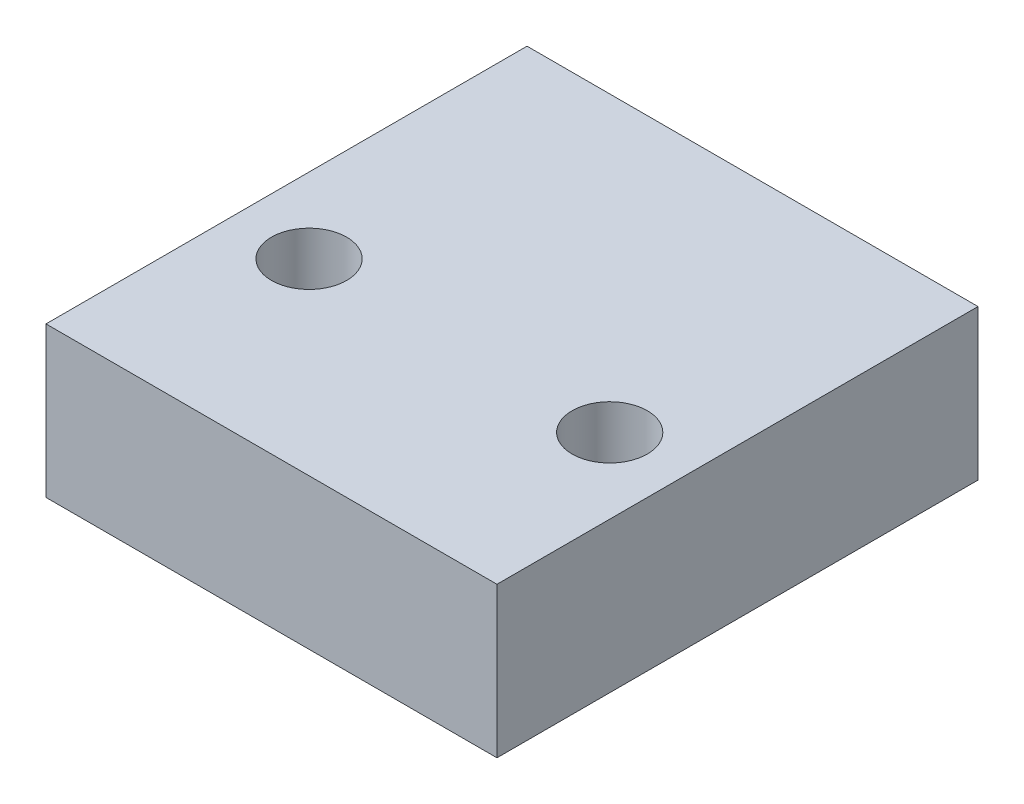
ISO-10303-21;
HEADER;
FILE_DESCRIPTION(('STEP AP214'),'2;1');
FILE_NAME('part.step','',(''),(''),'','','');
FILE_SCHEMA(('AUTOMOTIVE_DESIGN { 1 0 10303 214 1 1 1 1 }'));
ENDSEC;
DATA;
#1=APPLICATION_CONTEXT('core data for automotive mechanical design processes');
#2=APPLICATION_PROTOCOL_DEFINITION('international standard','automotive_design',2000,#1);
#3=PRODUCT_CONTEXT('',#1,'mechanical');
#4=PRODUCT('Part','Part','',(#3));
#5=PRODUCT_RELATED_PRODUCT_CATEGORY('part','',(#4));
#6=PRODUCT_DEFINITION_FORMATION('','',#4);
#7=PRODUCT_DEFINITION_CONTEXT('part definition',#1,'design');
#8=PRODUCT_DEFINITION('design','',#6,#7);
#9=PRODUCT_DEFINITION_SHAPE('','',#8);
#10=(LENGTH_UNIT() NAMED_UNIT(*) SI_UNIT(.MILLI.,.METRE.));
#11=(NAMED_UNIT(*) PLANE_ANGLE_UNIT() SI_UNIT($,.RADIAN.));
#12=(NAMED_UNIT(*) SI_UNIT($,.STERADIAN.) SOLID_ANGLE_UNIT());
#13=UNCERTAINTY_MEASURE_WITH_UNIT(LENGTH_MEASURE(1.E-05),#10,'distance_accuracy_value','');
#14=(GEOMETRIC_REPRESENTATION_CONTEXT(3) GLOBAL_UNCERTAINTY_ASSIGNED_CONTEXT((#13)) GLOBAL_UNIT_ASSIGNED_CONTEXT((#10,
#11,#12)) REPRESENTATION_CONTEXT('',''));
#15=CARTESIAN_POINT('',(0.,0.,0.));
#16=DIRECTION('',(0.,0.,1.));
#17=DIRECTION('',(1.,0.,0.));
#18=AXIS2_PLACEMENT_3D('',#15,#16,#17);
#19=CARTESIAN_POINT('',(15.,10.,0.));
#20=DIRECTION('',(1.,0.,0.));
#21=DIRECTION('',(0.,0.,-1.));
#22=AXIS2_PLACEMENT_3D('',#19,#20,#21);
#23=PLANE('',#22);
#24=DIRECTION('',(0.,0.,1.));
#25=VECTOR('',#24,1.);
#26=CARTESIAN_POINT('',(15.,0.,0.));
#27=LINE('',#26,#25);
#28=CARTESIAN_POINT('',(15.,0.,-19.5));
#29=VERTEX_POINT('',#28);
#30=CARTESIAN_POINT('',(15.,0.,12.5));
#31=VERTEX_POINT('',#30);
#32=EDGE_CURVE('E109',#29,#31,#27,.T.);
#33=ORIENTED_EDGE('',*,*,#32,.F.);
#34=DIRECTION('',(0.,-1.,0.));
#35=VECTOR('',#34,1.);
#36=CARTESIAN_POINT('',(15.,10.,-19.5));
#37=LINE('',#36,#35);
#38=CARTESIAN_POINT('',(15.,10.,-19.5));
#39=VERTEX_POINT('',#38);
#40=EDGE_CURVE('E11',#39,#29,#37,.T.);
#41=ORIENTED_EDGE('',*,*,#40,.F.);
#42=DIRECTION('',(0.,0.,1.));
#43=VECTOR('',#42,1.);
#44=CARTESIAN_POINT('',(15.,10.,0.));
#45=LINE('',#44,#43);
#46=CARTESIAN_POINT('',(15.,10.,12.5));
#47=VERTEX_POINT('',#46);
#48=EDGE_CURVE('E96',#39,#47,#45,.T.);
#49=ORIENTED_EDGE('',*,*,#48,.T.);
#50=DIRECTION('',(0.,-1.,0.));
#51=VECTOR('',#50,1.);
#52=CARTESIAN_POINT('',(15.,10.,12.5));
#53=LINE('',#52,#51);
#54=EDGE_CURVE('E75',#47,#31,#53,.T.);
#55=ORIENTED_EDGE('',*,*,#54,.T.);
#56=EDGE_LOOP('',(#33,#41,#49,#55));
#57=FACE_BOUND('',#56,.T.);
#58=ADVANCED_FACE('F35',(#57),#23,.T.);
#59=CARTESIAN_POINT('',(0.,10.,-19.5));
#60=DIRECTION('',(0.,0.,-1.));
#61=DIRECTION('',(-1.,0.,0.));
#62=AXIS2_PLACEMENT_3D('',#59,#60,#61);
#63=PLANE('',#62);
#64=DIRECTION('',(1.,0.,0.));
#65=VECTOR('',#64,1.);
#66=CARTESIAN_POINT('',(0.,0.,-19.5));
#67=LINE('',#66,#65);
#68=CARTESIAN_POINT('',(-15.,0.,-19.5));
#69=VERTEX_POINT('',#68);
#70=EDGE_CURVE('E87',#69,#29,#67,.T.);
#71=ORIENTED_EDGE('',*,*,#70,.F.);
#72=DIRECTION('',(0.,-1.,0.));
#73=VECTOR('',#72,1.);
#74=CARTESIAN_POINT('',(-15.,10.,-19.5));
#75=LINE('',#74,#73);
#76=CARTESIAN_POINT('',(-15.,10.,-19.5));
#77=VERTEX_POINT('',#76);
#78=EDGE_CURVE('E44',#77,#69,#75,.T.);
#79=ORIENTED_EDGE('',*,*,#78,.F.);
#80=DIRECTION('',(1.,0.,0.));
#81=VECTOR('',#80,1.);
#82=CARTESIAN_POINT('',(0.,10.,-19.5));
#83=LINE('',#82,#81);
#84=EDGE_CURVE('E85',#77,#39,#83,.T.);
#85=ORIENTED_EDGE('',*,*,#84,.T.);
#86=ORIENTED_EDGE('',*,*,#40,.T.);
#87=EDGE_LOOP('',(#71,#79,#85,#86));
#88=FACE_BOUND('',#87,.T.);
#89=ADVANCED_FACE('F83',(#88),#63,.T.);
#90=CARTESIAN_POINT('',(-15.,10.,0.));
#91=DIRECTION('',(1.,0.,0.));
#92=DIRECTION('',(0.,0.,-1.));
#93=AXIS2_PLACEMENT_3D('',#90,#91,#92);
#94=PLANE('',#93);
#95=DIRECTION('',(0.,0.,1.));
#96=VECTOR('',#95,1.);
#97=CARTESIAN_POINT('',(-15.,0.,0.));
#98=LINE('',#97,#96);
#99=CARTESIAN_POINT('',(-15.,0.,12.5));
#100=VERTEX_POINT('',#99);
#101=EDGE_CURVE('E112',#69,#100,#98,.T.);
#102=ORIENTED_EDGE('',*,*,#101,.T.);
#103=DIRECTION('',(0.,-1.,0.));
#104=VECTOR('',#103,1.);
#105=CARTESIAN_POINT('',(-15.,10.,12.5));
#106=LINE('',#105,#104);
#107=CARTESIAN_POINT('',(-15.,10.,12.5));
#108=VERTEX_POINT('',#107);
#109=EDGE_CURVE('E90',#108,#100,#106,.T.);
#110=ORIENTED_EDGE('',*,*,#109,.F.);
#111=DIRECTION('',(0.,0.,1.));
#112=VECTOR('',#111,1.);
#113=CARTESIAN_POINT('',(-15.,10.,0.));
#114=LINE('',#113,#112);
#115=EDGE_CURVE('E92',#77,#108,#114,.T.);
#116=ORIENTED_EDGE('',*,*,#115,.F.);
#117=ORIENTED_EDGE('',*,*,#78,.T.);
#118=EDGE_LOOP('',(#102,#110,#116,#117));
#119=FACE_BOUND('',#118,.T.);
#120=ADVANCED_FACE('F93',(#119),#94,.F.);
#121=CARTESIAN_POINT('',(-10.,10.,0.));
#122=DIRECTION('',(0.,-1.,0.));
#123=DIRECTION('',(0.,0.,-1.));
#124=AXIS2_PLACEMENT_3D('',#121,#122,#123);
#125=CYLINDRICAL_SURFACE('',#124,2.5);
#126=CARTESIAN_POINT('',(-10.,10.,0.));
#127=DIRECTION('',(0.,1.,0.));
#128=DIRECTION('',(0.,0.,1.));
#129=AXIS2_PLACEMENT_3D('',#126,#127,#128);
#130=CIRCLE('',#129,2.5);
#131=CARTESIAN_POINT('',(-10.,10.,2.5));
#132=VERTEX_POINT('',#131);
#133=EDGE_CURVE('E98',#132,#132,#130,.T.);
#134=ORIENTED_EDGE('',*,*,#133,.T.);
#135=EDGE_LOOP('',(#134));
#136=FACE_BOUND('',#135,.T.);
#137=CARTESIAN_POINT('',(-10.,0.,0.));
#138=DIRECTION('',(0.,1.,0.));
#139=DIRECTION('',(0.,0.,1.));
#140=AXIS2_PLACEMENT_3D('',#137,#138,#139);
#141=CIRCLE('',#140,2.5);
#142=CARTESIAN_POINT('',(-10.,0.,2.5));
#143=VERTEX_POINT('',#142);
#144=EDGE_CURVE('E106',#143,#143,#141,.T.);
#145=ORIENTED_EDGE('',*,*,#144,.F.);
#146=EDGE_LOOP('',(#145));
#147=FACE_BOUND('',#146,.T.);
#148=ADVANCED_FACE('F127',(#136,#147),#125,.F.);
#149=CARTESIAN_POINT('',(10.,10.,0.));
#150=DIRECTION('',(0.,-1.,0.));
#151=DIRECTION('',(0.,0.,-1.));
#152=AXIS2_PLACEMENT_3D('',#149,#150,#151);
#153=CYLINDRICAL_SURFACE('',#152,2.5);
#154=CARTESIAN_POINT('',(10.,10.,0.));
#155=DIRECTION('',(0.,1.,0.));
#156=DIRECTION('',(0.,0.,1.));
#157=AXIS2_PLACEMENT_3D('',#154,#155,#156);
#158=CIRCLE('',#157,2.5);
#159=CARTESIAN_POINT('',(10.,10.,2.5));
#160=VERTEX_POINT('',#159);
#161=EDGE_CURVE('E115',#160,#160,#158,.T.);
#162=ORIENTED_EDGE('',*,*,#161,.T.);
#163=EDGE_LOOP('',(#162));
#164=FACE_BOUND('',#163,.T.);
#165=CARTESIAN_POINT('',(10.,0.,0.));
#166=DIRECTION('',(0.,1.,0.));
#167=DIRECTION('',(0.,0.,1.));
#168=AXIS2_PLACEMENT_3D('',#165,#166,#167);
#169=CIRCLE('',#168,2.5);
#170=CARTESIAN_POINT('',(10.,0.,2.5));
#171=VERTEX_POINT('',#170);
#172=EDGE_CURVE('E103',#171,#171,#169,.T.);
#173=ORIENTED_EDGE('',*,*,#172,.F.);
#174=EDGE_LOOP('',(#173));
#175=FACE_BOUND('',#174,.T.);
#176=ADVANCED_FACE('F37',(#164,#175),#153,.F.);
#177=CARTESIAN_POINT('',(0.,10.,12.5));
#178=DIRECTION('',(0.,0.,-1.));
#179=DIRECTION('',(-1.,0.,0.));
#180=AXIS2_PLACEMENT_3D('',#177,#178,#179);
#181=PLANE('',#180);
#182=DIRECTION('',(1.,0.,0.));
#183=VECTOR('',#182,1.);
#184=CARTESIAN_POINT('',(0.,0.,12.5));
#185=LINE('',#184,#183);
#186=EDGE_CURVE('E68',#100,#31,#185,.T.);
#187=ORIENTED_EDGE('',*,*,#186,.T.);
#188=ORIENTED_EDGE('',*,*,#54,.F.);
#189=DIRECTION('',(1.,0.,0.));
#190=VECTOR('',#189,1.);
#191=CARTESIAN_POINT('',(0.,10.,12.5));
#192=LINE('',#191,#190);
#193=EDGE_CURVE('E52',#108,#47,#192,.T.);
#194=ORIENTED_EDGE('',*,*,#193,.F.);
#195=ORIENTED_EDGE('',*,*,#109,.T.);
#196=EDGE_LOOP('',(#187,#188,#194,#195));
#197=FACE_BOUND('',#196,.T.);
#198=ADVANCED_FACE('F118',(#197),#181,.F.);
#199=CARTESIAN_POINT('',(0.,10.,0.));
#200=DIRECTION('',(0.,1.,0.));
#201=DIRECTION('',(0.,0.,1.));
#202=AXIS2_PLACEMENT_3D('',#199,#200,#201);
#203=PLANE('',#202);
#204=ORIENTED_EDGE('',*,*,#161,.F.);
#205=EDGE_LOOP('',(#204));
#206=FACE_BOUND('',#205,.T.);
#207=ORIENTED_EDGE('',*,*,#133,.F.);
#208=EDGE_LOOP('',(#207));
#209=FACE_BOUND('',#208,.T.);
#210=ORIENTED_EDGE('',*,*,#48,.F.);
#211=ORIENTED_EDGE('',*,*,#84,.F.);
#212=ORIENTED_EDGE('',*,*,#115,.T.);
#213=ORIENTED_EDGE('',*,*,#193,.T.);
#214=EDGE_LOOP('',(#210,#211,#212,#213));
#215=FACE_BOUND('',#214,.T.);
#216=ADVANCED_FACE('F95',(#206,#209,#215),#203,.T.);
#217=CARTESIAN_POINT('',(0.,0.,0.));
#218=DIRECTION('',(0.,1.,0.));
#219=DIRECTION('',(0.,0.,1.));
#220=AXIS2_PLACEMENT_3D('',#217,#218,#219);
#221=PLANE('',#220);
#222=ORIENTED_EDGE('',*,*,#172,.T.);
#223=EDGE_LOOP('',(#222));
#224=FACE_BOUND('',#223,.T.);
#225=ORIENTED_EDGE('',*,*,#144,.T.);
#226=EDGE_LOOP('',(#225));
#227=FACE_BOUND('',#226,.T.);
#228=ORIENTED_EDGE('',*,*,#32,.T.);
#229=ORIENTED_EDGE('',*,*,#186,.F.);
#230=ORIENTED_EDGE('',*,*,#101,.F.);
#231=ORIENTED_EDGE('',*,*,#70,.T.);
#232=EDGE_LOOP('',(#228,#229,#230,#231));
#233=FACE_BOUND('',#232,.T.);
#234=ADVANCED_FACE('F119',(#224,#227,#233),#221,.F.);
#235=CLOSED_SHELL('',(#58,#89,#120,#148,#176,#198,#216,#234));
#236=MANIFOLD_SOLID_BREP('B2',#235);
#237=ADVANCED_BREP_SHAPE_REPRESENTATION('',(#18,#236),#14);
#238=SHAPE_DEFINITION_REPRESENTATION(#9,#237);
ENDSEC;
END-ISO-10303-21;
